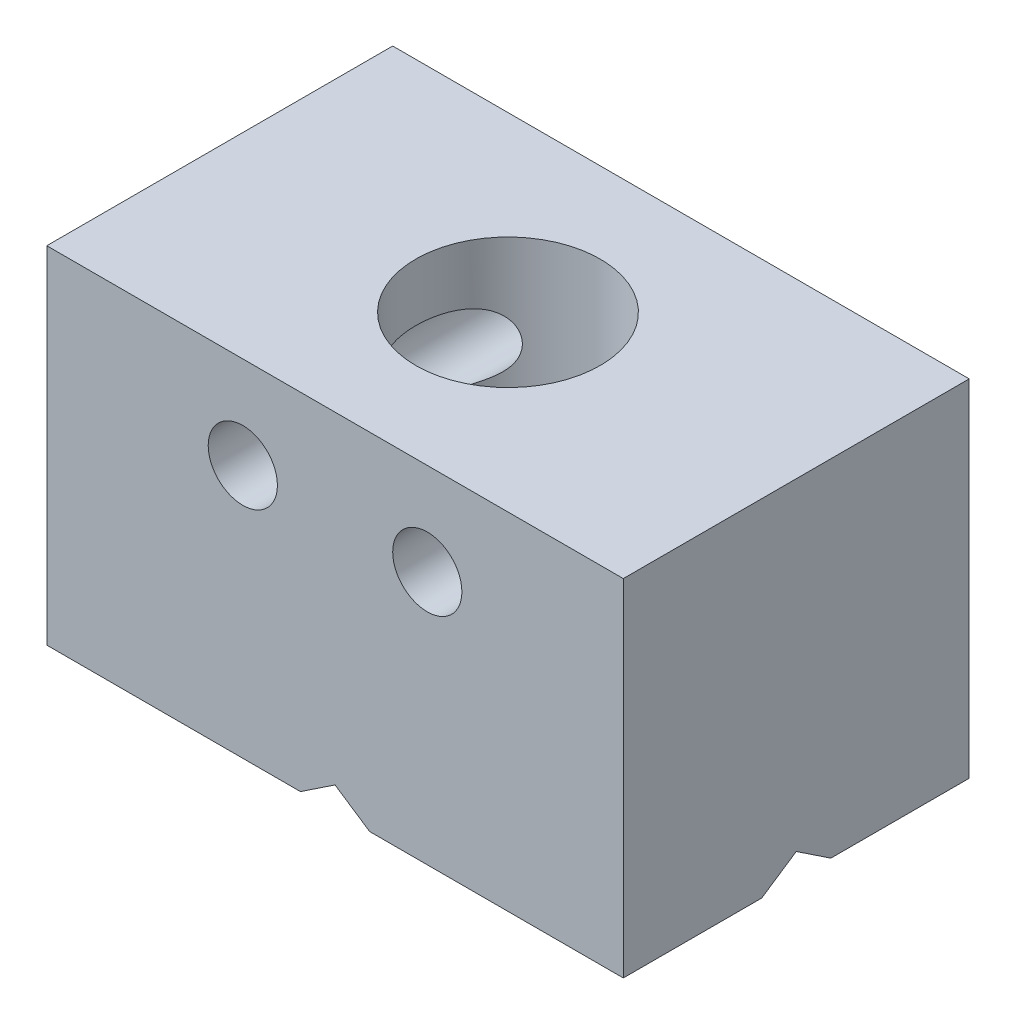
ISO-10303-21;
HEADER;
FILE_DESCRIPTION(('STEP AP214'),'2;1');
FILE_NAME('part.step','',(''),(''),'','','');
FILE_SCHEMA(('AUTOMOTIVE_DESIGN { 1 0 10303 214 1 1 1 1 }'));
ENDSEC;
DATA;
#1=APPLICATION_CONTEXT('core data for automotive mechanical design processes');
#2=APPLICATION_PROTOCOL_DEFINITION('international standard','automotive_design',2000,#1);
#3=PRODUCT_CONTEXT('',#1,'mechanical');
#4=PRODUCT('Part','Part','',(#3));
#5=PRODUCT_RELATED_PRODUCT_CATEGORY('part','',(#4));
#6=PRODUCT_DEFINITION_FORMATION('','',#4);
#7=PRODUCT_DEFINITION_CONTEXT('part definition',#1,'design');
#8=PRODUCT_DEFINITION('design','',#6,#7);
#9=PRODUCT_DEFINITION_SHAPE('','',#8);
#10=(LENGTH_UNIT() NAMED_UNIT(*) SI_UNIT(.MILLI.,.METRE.));
#11=(NAMED_UNIT(*) PLANE_ANGLE_UNIT() SI_UNIT($,.RADIAN.));
#12=(NAMED_UNIT(*) SI_UNIT($,.STERADIAN.) SOLID_ANGLE_UNIT());
#13=UNCERTAINTY_MEASURE_WITH_UNIT(LENGTH_MEASURE(1.E-05),#10,'distance_accuracy_value','');
#14=(GEOMETRIC_REPRESENTATION_CONTEXT(3) GLOBAL_UNCERTAINTY_ASSIGNED_CONTEXT((#13)) GLOBAL_UNIT_ASSIGNED_CONTEXT((#10,
#11,#12)) REPRESENTATION_CONTEXT('',''));
#15=CARTESIAN_POINT('',(0.,0.,0.));
#16=DIRECTION('',(0.,0.,1.));
#17=DIRECTION('',(1.,0.,0.));
#18=AXIS2_PLACEMENT_3D('',#15,#16,#17);
#19=CARTESIAN_POINT('',(12.5,-7.5,15.));
#20=DIRECTION('',(0.,1.,0.));
#21=DIRECTION('',(-1.,0.,0.));
#22=AXIS2_PLACEMENT_3D('',#19,#20,#21);
#23=PLANE('',#22);
#24=DIRECTION('',(0.,0.,-1.));
#25=VECTOR('',#24,1.);
#26=CARTESIAN_POINT('',(12.5,-7.5,15.));
#27=LINE('',#26,#25);
#28=CARTESIAN_POINT('',(12.5,-7.5,6.));
#29=VERTEX_POINT('',#28);
#30=CARTESIAN_POINT('',(12.5,-7.5,0.));
#31=VERTEX_POINT('',#30);
#32=EDGE_CURVE('E314',#29,#31,#27,.T.);
#33=ORIENTED_EDGE('',*,*,#32,.F.);
#34=DIRECTION('',(-1.,0.,0.));
#35=VECTOR('',#34,1.);
#36=CARTESIAN_POINT('',(36.5,-7.5,6.));
#37=LINE('',#36,#35);
#38=CARTESIAN_POINT('',(1.50000000000001,-7.50000000000001,6.));
#39=VERTEX_POINT('',#38);
#40=EDGE_CURVE('E385',#29,#39,#37,.T.);
#41=ORIENTED_EDGE('',*,*,#40,.T.);
#42=DIRECTION('',(0.,0.,-1.));
#43=VECTOR('',#42,1.);
#44=CARTESIAN_POINT('',(1.5,-7.5,15.));
#45=LINE('',#44,#43);
#46=CARTESIAN_POINT('',(1.5,-7.5,0.));
#47=VERTEX_POINT('',#46);
#48=EDGE_CURVE('E246',#39,#47,#45,.T.);
#49=ORIENTED_EDGE('',*,*,#48,.T.);
#50=DIRECTION('',(1.,0.,0.));
#51=VECTOR('',#50,1.);
#52=CARTESIAN_POINT('',(12.5,-7.5,0.));
#53=LINE('',#52,#51);
#54=EDGE_CURVE('E297',#47,#31,#53,.T.);
#55=ORIENTED_EDGE('',*,*,#54,.T.);
#56=EDGE_LOOP('',(#33,#41,#49,#55));
#57=FACE_BOUND('',#56,.T.);
#58=ADVANCED_FACE('F39',(#57),#23,.F.);
#59=DIRECTION('',(0.,0.,-1.));
#60=VECTOR('',#59,1.);
#61=CARTESIAN_POINT('',(-1.5,-7.5,15.));
#62=LINE('',#61,#60);
#63=CARTESIAN_POINT('',(-1.50000000000001,-7.5,6.));
#64=VERTEX_POINT('',#63);
#65=CARTESIAN_POINT('',(-1.5,-7.5,0.));
#66=VERTEX_POINT('',#65);
#67=EDGE_CURVE('E264',#64,#66,#62,.T.);
#68=ORIENTED_EDGE('',*,*,#67,.F.);
#69=CARTESIAN_POINT('',(-12.5,-7.5,6.));
#70=VERTEX_POINT('',#69);
#71=EDGE_CURVE('E375',#64,#70,#37,.T.);
#72=ORIENTED_EDGE('',*,*,#71,.T.);
#73=DIRECTION('',(0.,0.,-1.));
#74=VECTOR('',#73,1.);
#75=CARTESIAN_POINT('',(-12.5,-7.5,15.));
#76=LINE('',#75,#74);
#77=CARTESIAN_POINT('',(-12.5,-7.5,0.));
#78=VERTEX_POINT('',#77);
#79=EDGE_CURVE('E318',#70,#78,#76,.T.);
#80=ORIENTED_EDGE('',*,*,#79,.T.);
#81=EDGE_CURVE('E298',#78,#66,#53,.T.);
#82=ORIENTED_EDGE('',*,*,#81,.T.);
#83=EDGE_LOOP('',(#68,#72,#80,#82));
#84=FACE_BOUND('',#83,.T.);
#85=ADVANCED_FACE('F204',(#84),#23,.F.);
#86=CARTESIAN_POINT('',(1.5,-7.5,15.));
#87=DIRECTION('',(0.554700196225229,0.832050294337844,0.));
#88=DIRECTION('',(-0.832050294337844,0.554700196225229,0.));
#89=AXIS2_PLACEMENT_3D('',#86,#87,#88);
#90=PLANE('',#89);
#91=ORIENTED_EDGE('',*,*,#48,.F.);
#92=DIRECTION('',(-0.639602149066831,0.426401432711221,0.639602149066832));
#93=VECTOR('',#92,1.);
#94=CARTESIAN_POINT('',(-2.18181818181818,-5.04545454545455,9.68181818181819));
#95=LINE('',#94,#93);
#96=CARTESIAN_POINT('',(0.,-6.5,7.5));
#97=VERTEX_POINT('',#96);
#98=EDGE_CURVE('E342',#39,#97,#95,.T.);
#99=ORIENTED_EDGE('',*,*,#98,.T.);
#100=DIRECTION('',(0.,0.,-1.));
#101=VECTOR('',#100,1.);
#102=CARTESIAN_POINT('',(0.,-6.5,15.));
#103=LINE('',#102,#101);
#104=CARTESIAN_POINT('',(0.,-6.5,0.));
#105=VERTEX_POINT('',#104);
#106=EDGE_CURVE('E260',#97,#105,#103,.T.);
#107=ORIENTED_EDGE('',*,*,#106,.T.);
#108=DIRECTION('',(0.832050294337844,-0.554700196225229,0.));
#109=VECTOR('',#108,1.);
#110=CARTESIAN_POINT('',(1.5,-7.5,0.));
#111=LINE('',#110,#109);
#112=EDGE_CURVE('E256',#105,#47,#111,.T.);
#113=ORIENTED_EDGE('',*,*,#112,.T.);
#114=EDGE_LOOP('',(#91,#99,#107,#113));
#115=FACE_BOUND('',#114,.T.);
#116=ADVANCED_FACE('F190',(#115),#90,.F.);
#117=CARTESIAN_POINT('',(0.,-6.5,15.));
#118=DIRECTION('',(-0.554700196225229,0.832050294337844,0.));
#119=DIRECTION('',(-0.832050294337844,-0.554700196225229,0.));
#120=AXIS2_PLACEMENT_3D('',#117,#118,#119);
#121=PLANE('',#120);
#122=ORIENTED_EDGE('',*,*,#106,.F.);
#123=DIRECTION('',(-0.639602149066831,-0.42640143271122,-0.639602149066832));
#124=VECTOR('',#123,1.);
#125=CARTESIAN_POINT('',(3.06818181818182,-4.45454545454546,10.5681818181818));
#126=LINE('',#125,#124);
#127=EDGE_CURVE('E11',#97,#64,#126,.T.);
#128=ORIENTED_EDGE('',*,*,#127,.T.);
#129=ORIENTED_EDGE('',*,*,#67,.T.);
#130=DIRECTION('',(0.832050294337844,0.554700196225229,0.));
#131=VECTOR('',#130,1.);
#132=CARTESIAN_POINT('',(0.,-6.5,0.));
#133=LINE('',#132,#131);
#134=EDGE_CURVE('E336',#66,#105,#133,.T.);
#135=ORIENTED_EDGE('',*,*,#134,.T.);
#136=EDGE_LOOP('',(#122,#128,#129,#135));
#137=FACE_BOUND('',#136,.T.);
#138=ADVANCED_FACE('F193',(#137),#121,.F.);
#139=CARTESIAN_POINT('',(1.5,-7.5,15.));
#140=VERTEX_POINT('',#139);
#141=CARTESIAN_POINT('',(1.49999999999999,-7.5,9.));
#142=VERTEX_POINT('',#141);
#143=EDGE_CURVE('E238',#140,#142,#45,.T.);
#144=ORIENTED_EDGE('',*,*,#143,.T.);
#145=DIRECTION('',(-1.,0.,0.));
#146=VECTOR('',#145,1.);
#147=CARTESIAN_POINT('',(36.5,-7.5,9.));
#148=LINE('',#147,#146);
#149=CARTESIAN_POINT('',(12.5,-7.5,9.));
#150=VERTEX_POINT('',#149);
#151=EDGE_CURVE('E240',#150,#142,#148,.T.);
#152=ORIENTED_EDGE('',*,*,#151,.F.);
#153=CARTESIAN_POINT('',(12.5,-7.5,15.));
#154=VERTEX_POINT('',#153);
#155=EDGE_CURVE('E315',#154,#150,#27,.T.);
#156=ORIENTED_EDGE('',*,*,#155,.F.);
#157=DIRECTION('',(1.,0.,0.));
#158=VECTOR('',#157,1.);
#159=CARTESIAN_POINT('',(12.5,-7.5,15.));
#160=LINE('',#159,#158);
#161=EDGE_CURVE('E242',#140,#154,#160,.T.);
#162=ORIENTED_EDGE('',*,*,#161,.F.);
#163=EDGE_LOOP('',(#144,#152,#156,#162));
#164=FACE_BOUND('',#163,.T.);
#165=ADVANCED_FACE('F211',(#164),#23,.F.);
#166=CARTESIAN_POINT('',(0.,0.,0.));
#167=DIRECTION('',(0.,0.,1.));
#168=DIRECTION('',(1.,0.,0.));
#169=AXIS2_PLACEMENT_3D('',#166,#167,#168);
#170=PLANE('',#169);
#171=CARTESIAN_POINT('',(4.,3.5,0.));
#172=DIRECTION('',(0.,0.,-1.));
#173=DIRECTION('',(-1.,0.,0.));
#174=AXIS2_PLACEMENT_3D('',#171,#172,#173);
#175=CIRCLE('',#174,1.5);
#176=CARTESIAN_POINT('',(2.5,3.5,0.));
#177=VERTEX_POINT('',#176);
#178=EDGE_CURVE('E269',#177,#177,#175,.T.);
#179=ORIENTED_EDGE('',*,*,#178,.F.);
#180=EDGE_LOOP('',(#179));
#181=FACE_BOUND('',#180,.T.);
#182=ORIENTED_EDGE('',*,*,#54,.F.);
#183=ORIENTED_EDGE('',*,*,#112,.F.);
#184=ORIENTED_EDGE('',*,*,#134,.F.);
#185=ORIENTED_EDGE('',*,*,#81,.F.);
#186=DIRECTION('',(0.,-1.,0.));
#187=VECTOR('',#186,1.);
#188=CARTESIAN_POINT('',(-12.5,-7.5,0.));
#189=LINE('',#188,#187);
#190=CARTESIAN_POINT('',(-12.5,7.5,0.));
#191=VERTEX_POINT('',#190);
#192=EDGE_CURVE('E277',#191,#78,#189,.T.);
#193=ORIENTED_EDGE('',*,*,#192,.F.);
#194=DIRECTION('',(-1.,0.,0.));
#195=VECTOR('',#194,1.);
#196=CARTESIAN_POINT('',(12.5,7.5,0.));
#197=LINE('',#196,#195);
#198=CARTESIAN_POINT('',(12.5,7.5,0.));
#199=VERTEX_POINT('',#198);
#200=EDGE_CURVE('E282',#199,#191,#197,.T.);
#201=ORIENTED_EDGE('',*,*,#200,.F.);
#202=DIRECTION('',(0.,1.,0.));
#203=VECTOR('',#202,1.);
#204=CARTESIAN_POINT('',(12.5,-7.5,0.));
#205=LINE('',#204,#203);
#206=EDGE_CURVE('E302',#31,#199,#205,.T.);
#207=ORIENTED_EDGE('',*,*,#206,.F.);
#208=EDGE_LOOP('',(#182,#183,#184,#185,#193,#201,#207));
#209=FACE_BOUND('',#208,.T.);
#210=CARTESIAN_POINT('',(-4.,3.5,0.));
#211=DIRECTION('',(0.,0.,-1.));
#212=DIRECTION('',(-1.,0.,0.));
#213=AXIS2_PLACEMENT_3D('',#210,#211,#212);
#214=CIRCLE('',#213,1.5);
#215=CARTESIAN_POINT('',(-5.5,3.5,0.));
#216=VERTEX_POINT('',#215);
#217=EDGE_CURVE('E245',#216,#216,#214,.T.);
#218=ORIENTED_EDGE('',*,*,#217,.F.);
#219=EDGE_LOOP('',(#218));
#220=FACE_BOUND('',#219,.T.);
#221=ADVANCED_FACE('F223',(#181,#209,#220),#170,.F.);
#222=CARTESIAN_POINT('',(-12.5,-7.5,15.));
#223=DIRECTION('',(1.,0.,0.));
#224=DIRECTION('',(0.,0.,-1.));
#225=AXIS2_PLACEMENT_3D('',#222,#223,#224);
#226=PLANE('',#225);
#227=ORIENTED_EDGE('',*,*,#79,.F.);
#228=DIRECTION('',(0.,-0.554700196225229,-0.832050294337844));
#229=VECTOR('',#228,1.);
#230=CARTESIAN_POINT('',(-12.5,-7.5,6.));
#231=LINE('',#230,#229);
#232=CARTESIAN_POINT('',(-12.5,-6.5,7.5));
#233=VERTEX_POINT('',#232);
#234=EDGE_CURVE('E391',#233,#70,#231,.T.);
#235=ORIENTED_EDGE('',*,*,#234,.F.);
#236=DIRECTION('',(0.,0.554700196225228,-0.832050294337844));
#237=VECTOR('',#236,1.);
#238=CARTESIAN_POINT('',(-12.5,-6.5,7.5));
#239=LINE('',#238,#237);
#240=CARTESIAN_POINT('',(-12.5,-7.5,9.));
#241=VERTEX_POINT('',#240);
#242=EDGE_CURVE('E166',#241,#233,#239,.T.);
#243=ORIENTED_EDGE('',*,*,#242,.F.);
#244=CARTESIAN_POINT('',(-12.5,-7.5,15.));
#245=VERTEX_POINT('',#244);
#246=EDGE_CURVE('E319',#245,#241,#76,.T.);
#247=ORIENTED_EDGE('',*,*,#246,.F.);
#248=DIRECTION('',(0.,-1.,0.));
#249=VECTOR('',#248,1.);
#250=CARTESIAN_POINT('',(-12.5,-7.5,15.));
#251=LINE('',#250,#249);
#252=CARTESIAN_POINT('',(-12.5,7.5,15.));
#253=VERTEX_POINT('',#252);
#254=EDGE_CURVE('E278',#253,#245,#251,.T.);
#255=ORIENTED_EDGE('',*,*,#254,.F.);
#256=DIRECTION('',(0.,0.,-1.));
#257=VECTOR('',#256,1.);
#258=CARTESIAN_POINT('',(-12.5,7.5,15.));
#259=LINE('',#258,#257);
#260=EDGE_CURVE('E293',#253,#191,#259,.T.);
#261=ORIENTED_EDGE('',*,*,#260,.T.);
#262=ORIENTED_EDGE('',*,*,#192,.T.);
#263=EDGE_LOOP('',(#227,#235,#243,#247,#255,#261,#262));
#264=FACE_BOUND('',#263,.T.);
#265=ADVANCED_FACE('F41',(#264),#226,.F.);
#266=ORIENTED_EDGE('',*,*,#246,.T.);
#267=CARTESIAN_POINT('',(-1.50000000000001,-7.5,9.));
#268=VERTEX_POINT('',#267);
#269=EDGE_CURVE('E395',#268,#241,#148,.T.);
#270=ORIENTED_EDGE('',*,*,#269,.F.);
#271=CARTESIAN_POINT('',(-1.5,-7.5,15.));
#272=VERTEX_POINT('',#271);
#273=EDGE_CURVE('E261',#272,#268,#62,.T.);
#274=ORIENTED_EDGE('',*,*,#273,.F.);
#275=EDGE_CURVE('E283',#245,#272,#160,.T.);
#276=ORIENTED_EDGE('',*,*,#275,.F.);
#277=EDGE_LOOP('',(#266,#270,#274,#276));
#278=FACE_BOUND('',#277,.T.);
#279=ADVANCED_FACE('F206',(#278),#23,.F.);
#280=CARTESIAN_POINT('',(12.5,-7.5,15.));
#281=DIRECTION('',(-1.,0.,0.));
#282=DIRECTION('',(0.,0.,1.));
#283=AXIS2_PLACEMENT_3D('',#280,#281,#282);
#284=PLANE('',#283);
#285=DIRECTION('',(0.,0.554700196225228,-0.832050294337845));
#286=VECTOR('',#285,1.);
#287=CARTESIAN_POINT('',(12.5,-10.2692307692308,13.1538461538462));
#288=LINE('',#287,#286);
#289=CARTESIAN_POINT('',(12.5,-6.5,7.5));
#290=VERTEX_POINT('',#289);
#291=EDGE_CURVE('E346',#150,#290,#288,.T.);
#292=ORIENTED_EDGE('',*,*,#291,.T.);
#293=DIRECTION('',(0.,-0.554700196225229,-0.832050294337844));
#294=VECTOR('',#293,1.);
#295=CARTESIAN_POINT('',(12.5,-3.34615384615385,12.2307692307692));
#296=LINE('',#295,#294);
#297=EDGE_CURVE('E345',#290,#29,#296,.T.);
#298=ORIENTED_EDGE('',*,*,#297,.T.);
#299=ORIENTED_EDGE('',*,*,#32,.T.);
#300=ORIENTED_EDGE('',*,*,#206,.T.);
#301=DIRECTION('',(0.,0.,-1.));
#302=VECTOR('',#301,1.);
#303=CARTESIAN_POINT('',(12.5,7.5,15.));
#304=LINE('',#303,#302);
#305=CARTESIAN_POINT('',(12.5,7.5,15.));
#306=VERTEX_POINT('',#305);
#307=EDGE_CURVE('E310',#306,#199,#304,.T.);
#308=ORIENTED_EDGE('',*,*,#307,.F.);
#309=DIRECTION('',(0.,1.,0.));
#310=VECTOR('',#309,1.);
#311=CARTESIAN_POINT('',(12.5,-7.5,15.));
#312=LINE('',#311,#310);
#313=EDGE_CURVE('E287',#154,#306,#312,.T.);
#314=ORIENTED_EDGE('',*,*,#313,.F.);
#315=ORIENTED_EDGE('',*,*,#155,.T.);
#316=EDGE_LOOP('',(#292,#298,#299,#300,#308,#314,#315));
#317=FACE_BOUND('',#316,.T.);
#318=ADVANCED_FACE('F215',(#317),#284,.F.);
#319=CARTESIAN_POINT('',(12.5,7.5,15.));
#320=DIRECTION('',(0.,-1.,0.));
#321=DIRECTION('',(1.,0.,0.));
#322=AXIS2_PLACEMENT_3D('',#319,#320,#321);
#323=PLANE('',#322);
#324=CARTESIAN_POINT('',(0.,7.5,7.5));
#325=DIRECTION('',(0.,1.,0.));
#326=DIRECTION('',(0.,0.,1.));
#327=AXIS2_PLACEMENT_3D('',#324,#325,#326);
#328=CIRCLE('',#327,4.);
#329=CARTESIAN_POINT('',(0.,7.5,11.5));
#330=VERTEX_POINT('',#329);
#331=EDGE_CURVE('E150',#330,#330,#328,.T.);
#332=ORIENTED_EDGE('',*,*,#331,.F.);
#333=EDGE_LOOP('',(#332));
#334=FACE_BOUND('',#333,.T.);
#335=ORIENTED_EDGE('',*,*,#200,.T.);
#336=ORIENTED_EDGE('',*,*,#260,.F.);
#337=DIRECTION('',(-1.,0.,0.));
#338=VECTOR('',#337,1.);
#339=CARTESIAN_POINT('',(12.5,7.5,15.));
#340=LINE('',#339,#338);
#341=EDGE_CURVE('E290',#306,#253,#340,.T.);
#342=ORIENTED_EDGE('',*,*,#341,.F.);
#343=ORIENTED_EDGE('',*,*,#307,.T.);
#344=EDGE_LOOP('',(#335,#336,#342,#343));
#345=FACE_BOUND('',#344,.T.);
#346=ADVANCED_FACE('F221',(#334,#345),#323,.F.);
#347=CARTESIAN_POINT('',(0.,0.,15.));
#348=DIRECTION('',(0.,0.,1.));
#349=DIRECTION('',(1.,0.,0.));
#350=AXIS2_PLACEMENT_3D('',#347,#348,#349);
#351=PLANE('',#350);
#352=DIRECTION('',(0.832050294337844,-0.554700196225229,0.));
#353=VECTOR('',#352,1.);
#354=CARTESIAN_POINT('',(1.5,-7.5,15.));
#355=LINE('',#354,#353);
#356=CARTESIAN_POINT('',(0.,-6.5,15.));
#357=VERTEX_POINT('',#356);
#358=EDGE_CURVE('E69',#357,#140,#355,.T.);
#359=ORIENTED_EDGE('',*,*,#358,.T.);
#360=ORIENTED_EDGE('',*,*,#161,.T.);
#361=ORIENTED_EDGE('',*,*,#313,.T.);
#362=ORIENTED_EDGE('',*,*,#341,.T.);
#363=ORIENTED_EDGE('',*,*,#254,.T.);
#364=ORIENTED_EDGE('',*,*,#275,.T.);
#365=DIRECTION('',(0.832050294337844,0.554700196225229,0.));
#366=VECTOR('',#365,1.);
#367=CARTESIAN_POINT('',(0.,-6.5,15.));
#368=LINE('',#367,#366);
#369=EDGE_CURVE('E356',#272,#357,#368,.T.);
#370=ORIENTED_EDGE('',*,*,#369,.T.);
#371=EDGE_LOOP('',(#359,#360,#361,#362,#363,#364,#370));
#372=FACE_BOUND('',#371,.T.);
#373=CARTESIAN_POINT('',(-4.,3.5,15.));
#374=DIRECTION('',(0.,0.,1.));
#375=DIRECTION('',(1.,0.,0.));
#376=AXIS2_PLACEMENT_3D('',#373,#374,#375);
#377=CIRCLE('',#376,1.5);
#378=CARTESIAN_POINT('',(-2.5,3.5,15.));
#379=VERTEX_POINT('',#378);
#380=EDGE_CURVE('E251',#379,#379,#377,.T.);
#381=ORIENTED_EDGE('',*,*,#380,.F.);
#382=EDGE_LOOP('',(#381));
#383=FACE_BOUND('',#382,.T.);
#384=CARTESIAN_POINT('',(4.,3.5,15.));
#385=DIRECTION('',(0.,0.,1.));
#386=DIRECTION('',(1.,0.,0.));
#387=AXIS2_PLACEMENT_3D('',#384,#385,#386);
#388=CIRCLE('',#387,1.5);
#389=CARTESIAN_POINT('',(5.5,3.5,15.));
#390=VERTEX_POINT('',#389);
#391=EDGE_CURVE('E273',#390,#390,#388,.T.);
#392=ORIENTED_EDGE('',*,*,#391,.F.);
#393=EDGE_LOOP('',(#392));
#394=FACE_BOUND('',#393,.T.);
#395=ADVANCED_FACE('F200',(#372,#383,#394),#351,.T.);
#396=CARTESIAN_POINT('',(4.,3.5,0.));
#397=DIRECTION('',(0.,0.,-1.));
#398=DIRECTION('',(-1.,0.,0.));
#399=AXIS2_PLACEMENT_3D('',#396,#397,#398);
#400=CYLINDRICAL_SURFACE('',#399,1.5);
#401=CARTESIAN_POINT('',(2.5,3.5,10.6224989991992));
#402=CARTESIAN_POINT('',(2.50000237563999,3.56844507317665,10.6224984583015));
#403=CARTESIAN_POINT('',(2.5047136716075,3.63691446866875,10.6187428307556));
#404=CARTESIAN_POINT('',(2.52325594483903,3.77178518304479,10.6037583970504));
#405=CARTESIAN_POINT('',(2.53709204758336,3.83818531764219,10.5925253907517));
#406=CARTESIAN_POINT('',(2.57293547359494,3.96683585866649,10.5627665406718));
#407=CARTESIAN_POINT('',(2.59492392949486,4.02909545838286,10.544257530167));
#408=CARTESIAN_POINT('',(2.64568692155641,4.14809251520525,10.5002439315446));
#409=CARTESIAN_POINT('',(2.67446128429536,4.20483011338085,10.4747395222009));
#410=CARTESIAN_POINT('',(2.73810694361181,4.31345865663773,10.4162796101607));
#411=CARTESIAN_POINT('',(2.77314279157787,4.36513856482558,10.3831132724741));
#412=CARTESIAN_POINT('',(2.84670451040628,4.46102493857734,10.3105073956264));
#413=CARTESIAN_POINT('',(2.88523184758638,4.50522824165037,10.2710652155004));
#414=CARTESIAN_POINT('',(2.98141478003728,4.60413824909643,10.167967855078));
#415=CARTESIAN_POINT('',(3.03999055907052,4.65483708709788,10.1013215740566));
#416=CARTESIAN_POINT('',(3.15634540786731,4.74241053870565,9.95885833615759));
#417=CARTESIAN_POINT('',(3.21412255353142,4.77925599629143,9.88302247712024));
#418=CARTESIAN_POINT('',(3.31084375081771,4.83313297491591,9.74574395953113));
#419=CARTESIAN_POINT('',(3.35067029539931,4.85282826677813,9.685923115564));
#420=CARTESIAN_POINT('',(3.42763315063207,4.88714573550983,9.5631476523231));
#421=CARTESIAN_POINT('',(3.46476819384456,4.9017655344335,9.50019157989876));
#422=CARTESIAN_POINT('',(3.53588883198726,4.92689379907789,9.37160402893009));
#423=CARTESIAN_POINT('',(3.56986876735441,4.93739498165646,9.30596803555821));
#424=CARTESIAN_POINT('',(3.63429262498123,4.95511965276579,9.17254581884858));
#425=CARTESIAN_POINT('',(3.66473552255354,4.96234219321991,9.10475897961111));
#426=CARTESIAN_POINT('',(3.73424945418183,4.97686603409856,8.93761793820791));
#427=CARTESIAN_POINT('',(3.77133858388427,4.9828437471954,8.83731993597372));
#428=CARTESIAN_POINT('',(3.83739983959433,4.9915325535692,8.63393472747066));
#429=CARTESIAN_POINT('',(3.86636878431439,4.99424236793342,8.53084644533476));
#430=CARTESIAN_POINT('',(3.91595520583396,4.99785006983944,8.32264574868139));
#431=CARTESIAN_POINT('',(3.93657214290123,4.99874784029636,8.21753320380953));
#432=CARTESIAN_POINT('',(3.96930846625382,4.99977538627892,8.00600747540295));
#433=CARTESIAN_POINT('',(3.98142902695387,4.99990526796472,7.89959447369405));
#434=CARTESIAN_POINT('',(3.99721714653658,5.00001873923238,7.68453548116398));
#435=CARTESIAN_POINT('',(4.0007550770072,5.00000010339922,7.57587995000957));
#436=CARTESIAN_POINT('',(3.99897687795857,4.99999988466274,7.35863227418447));
#437=CARTESIAN_POINT('',(3.99365999729639,5.00001830490286,7.25004013567302));
#438=CARTESIAN_POINT('',(3.9742028497557,4.99980955757465,7.03360684173076));
#439=CARTESIAN_POINT('',(3.96005907813689,4.99958229243003,6.92576600181108));
#440=CARTESIAN_POINT('',(3.92304029316416,4.99813921620254,6.71160994759171));
#441=CARTESIAN_POINT('',(3.90016668323858,4.9969235639795,6.60529449091701));
#442=CARTESIAN_POINT('',(3.85025790288879,4.99268058370033,6.41197311843918));
#443=CARTESIAN_POINT('',(3.82449737909757,4.9899786847842,6.32462943376112));
#444=CARTESIAN_POINT('',(3.76711879145319,4.98209511109492,6.15200695391245));
#445=CARTESIAN_POINT('',(3.73550176357429,4.97691387464283,6.06672779655355));
#446=CARTESIAN_POINT('',(3.66670387500693,4.96292317926729,5.89891037191243));
#447=CARTESIAN_POINT('',(3.62953309661458,4.95412024542263,5.81636746235808));
#448=CARTESIAN_POINT('',(3.5500016579635,4.93150564603682,5.65457023883274));
#449=CARTESIAN_POINT('',(3.50764387637116,4.9176967504208,5.57531413316441));
#450=CARTESIAN_POINT('',(3.4076641107847,4.87936918867664,5.40237809649182));
#451=CARTESIAN_POINT('',(3.34881312115841,4.85307997905936,5.30977626891723));
#452=CARTESIAN_POINT('',(3.22625565514691,4.78691453896872,5.13297996612255));
#453=CARTESIAN_POINT('',(3.16255615588575,4.74705755623722,5.04877379811164));
#454=CARTESIAN_POINT('',(3.04789849020029,4.6608103465126,4.908339044801));
#455=CARTESIAN_POINT('',(2.99713759545654,4.61765445141011,4.84998331201076));
#456=CARTESIAN_POINT('',(2.89777469371295,4.51977526049942,4.74168892905724));
#457=CARTESIAN_POINT('',(2.8491701755548,4.46506587098744,4.69174028847616));
#458=CARTESIAN_POINT('',(2.76519273286627,4.3539704191013,4.60922176672559));
#459=CARTESIAN_POINT('',(2.72896106140803,4.29935890714051,4.57514386857898));
#460=CARTESIAN_POINT('',(2.66264346340817,4.18262390331085,4.51464457345066));
#461=CARTESIAN_POINT('',(2.63255606089229,4.12050222125433,4.48822133702875));
#462=CARTESIAN_POINT('',(2.580481743993,3.98983187660056,4.44348096350365));
#463=CARTESIAN_POINT('',(2.55853276109643,3.92125494160811,4.42520170605563));
#464=CARTESIAN_POINT('',(2.52457600134729,3.77999074352951,4.39725790112044));
#465=CARTESIAN_POINT('',(2.51256593266413,3.70730443216345,4.38759136757164));
#466=CARTESIAN_POINT('',(2.49995949164929,3.56661905930583,4.37745955303601));
#467=CARTESIAN_POINT('',(2.49847718132942,3.49874883019748,4.37627995264991));
#468=CARTESIAN_POINT('',(2.50467726966921,3.36371296656086,4.38124893815317));
#469=CARTESIAN_POINT('',(2.51235709343259,3.29654713942024,4.38739546513114));
#470=CARTESIAN_POINT('',(2.53608695804431,3.16649848612624,4.40670306421038));
#471=CARTESIAN_POINT('',(2.55192843404271,3.10355117031841,4.4196895233468));
#472=CARTESIAN_POINT('',(2.59089637791697,2.98181778654184,4.4523946016844));
#473=CARTESIAN_POINT('',(2.61402298183211,2.92303179630498,4.47211334660193));
#474=CARTESIAN_POINT('',(2.66720635243565,2.80878386720134,4.51884197598395));
#475=CARTESIAN_POINT('',(2.69749032182361,2.75352901504156,4.5460973734986));
#476=CARTESIAN_POINT('',(2.76272887503185,2.649751385927,4.60702257553303));
#477=CARTESIAN_POINT('',(2.79768497312702,2.60123080204019,4.64069446120147));
#478=CARTESIAN_POINT('',(2.87449570764897,2.50633748552443,4.7178166642497));
#479=CARTESIAN_POINT('',(2.91668647917853,2.46078376990674,4.76193437095376));
#480=CARTESIAN_POINT('',(3.00247716932196,2.3781701668522,4.85629067039247));
#481=CARTESIAN_POINT('',(3.04607781384109,2.34111473703709,4.90653245433796));
#482=CARTESIAN_POINT('',(3.12439434614296,2.28129365189303,5.00176351975041));
#483=CARTESIAN_POINT('',(3.15917600317504,2.25715074197405,5.04585100558664));
#484=CARTESIAN_POINT('',(3.22783881457725,2.21336733452573,5.13688403107681));
#485=CARTESIAN_POINT('',(3.26171951636781,2.19372906341603,5.18383096957216));
#486=CARTESIAN_POINT('',(3.36131492719747,2.1406740116261,5.32854214561394));
#487=CARTESIAN_POINT('',(3.4248571664884,2.11320620274763,5.43002586353859));
#488=CARTESIAN_POINT('',(3.52881497633681,2.07513232617044,5.61431116745028));
#489=CARTESIAN_POINT('',(3.57108810228181,2.06204631243266,5.69562026760816));
#490=CARTESIAN_POINT('',(3.65018259075764,2.04078598978266,5.86152487578542));
#491=CARTESIAN_POINT('',(3.68700107966248,2.03261426294189,5.94612208664085));
#492=CARTESIAN_POINT('',(3.75479257296722,2.0197755728349,6.11794411563752));
#493=CARTESIAN_POINT('',(3.78576059964336,2.01511158407578,6.20517109874891));
#494=CARTESIAN_POINT('',(3.84158922458768,2.00812308305104,6.38162881441569));
#495=CARTESIAN_POINT('',(3.86645066534816,2.00579824792799,6.47085926870708));
#496=CARTESIAN_POINT('',(3.91093780371362,2.0024722829463,6.65504168823637));
#497=CARTESIAN_POINT('',(3.9302659562343,2.00153779883961,6.75006665360376));
#498=CARTESIAN_POINT('',(3.96197145568193,2.0003982884312,6.9412742486933));
#499=CARTESIAN_POINT('',(3.97434855808809,2.00019328778956,7.03745691901909));
#500=CARTESIAN_POINT('',(3.99208436342167,1.99999450956277,7.23045940593527));
#501=CARTESIAN_POINT('',(3.99744370426902,2.00000071277766,7.3272791638097));
#502=CARTESIAN_POINT('',(4.00111845761146,1.99999963178988,7.5210523073506));
#503=CARTESIAN_POINT('',(3.99943363062662,1.99999234712868,7.61800569744814));
#504=CARTESIAN_POINT('',(3.98820387830326,2.00003281208052,7.82683175038031));
#505=CARTESIAN_POINT('',(3.97745942474938,2.00008943655868,7.93864197287056));
#506=CARTESIAN_POINT('',(3.94660624742879,2.00087172125266,8.16098670349158));
#507=CARTESIAN_POINT('',(3.92649499822109,2.00159756195182,8.27152085933242));
#508=CARTESIAN_POINT('',(3.87705217131453,2.00484163439915,8.49048129031715));
#509=CARTESIAN_POINT('',(3.84772182513464,2.00735962680224,8.59890784494875));
#510=CARTESIAN_POINT('',(3.78012274194193,2.01581314626652,8.81272795806287));
#511=CARTESIAN_POINT('',(3.74185863293169,2.02174690616494,8.91812305530233));
#512=CARTESIAN_POINT('',(3.6454170968873,2.04146709200524,9.15254593329164));
#513=CARTESIAN_POINT('',(3.58464996952906,2.05692057732798,9.28041577750395));
#514=CARTESIAN_POINT('',(3.4846337037185,2.09087988565139,9.46526176775417));
#515=CARTESIAN_POINT('',(3.44984163064994,2.10398472653708,9.52568204344411));
#516=CARTESIAN_POINT('',(3.37770277497338,2.13461202905426,9.64380682121691));
#517=CARTESIAN_POINT('',(3.34035685578596,2.15213300297942,9.70151223013056));
#518=CARTESIAN_POINT('',(3.24697782951465,2.20122118372719,9.83807744471173));
#519=CARTESIAN_POINT('',(3.18987059889643,2.23558412348528,9.91524533060743));
#520=CARTESIAN_POINT('',(3.07416675808938,2.31769689732622,10.0608812829434));
#521=CARTESIAN_POINT('',(3.01557243079513,2.36542722187517,10.1293618183981));
#522=CARTESIAN_POINT('',(2.91291491153056,2.46452320694735,10.2421688078778));
#523=CARTESIAN_POINT('',(2.86837671809878,2.51303814899894,10.288551020765));
#524=CARTESIAN_POINT('',(2.78346269313089,2.61984057571062,10.3733136254166));
#525=CARTESIAN_POINT('',(2.74308610027774,2.67812626778185,10.4116954820723));
#526=CARTESIAN_POINT('',(2.66908238580457,2.80426761557776,10.4796908268526));
#527=CARTESIAN_POINT('',(2.63551043442811,2.87219445054717,10.5092335004171));
#528=CARTESIAN_POINT('',(2.57834311486124,3.01542611137453,10.5583633148209));
#529=CARTESIAN_POINT('',(2.55473421618741,3.09072075884043,10.5779639649427));
#530=CARTESIAN_POINT('',(2.52493344277133,3.22208295292628,10.60241077309));
#531=CARTESIAN_POINT('',(2.51562166238074,3.27697517767308,10.6099373523411));
#532=CARTESIAN_POINT('',(2.50315449914521,3.38790629673264,10.6199812548714));
#533=CARTESIAN_POINT('',(2.49999805440314,3.44394499157444,10.6224994421825));
#534=CARTESIAN_POINT('',(2.5,3.5,10.6224989991992));
#535=B_SPLINE_CURVE_WITH_KNOTS('',3,(#401,#402,#403,#404,#405,#406,#407,#408,#409,#410,#411,
#412,#413,#414,#415,#416,#417,#418,#419,#420,#421,#422,#423,#424,#425,#426,#427,#428,#429,#430,
#431,#432,#433,#434,#435,#436,#437,#438,#439,#440,#441,#442,#443,#444,#445,#446,#447,#448,#449,
#450,#451,#452,#453,#454,#455,#456,#457,#458,#459,#460,#461,#462,#463,#464,#465,#466,#467,#468,
#469,#470,#471,#472,#473,#474,#475,#476,#477,#478,#479,#480,#481,#482,#483,#484,#485,#486,#487,
#488,#489,#490,#491,#492,#493,#494,#495,#496,#497,#498,#499,#500,#501,#502,#503,#504,#505,#506,
#507,#508,#509,#510,#511,#512,#513,#514,#515,#516,#517,#518,#519,#520,#521,#522,#523,#524,#525,
#526,#527,#528,#529,#530,#531,#532,#533,#534),.UNSPECIFIED.,.T.,.F.,(4,2,2,2,2,2,2,2,2,2,2,2,2,
2,2,2,2,2,2,2,2,2,2,2,2,2,2,2,2,2,2,2,2,2,2,2,2,2,2,2,2,2,2,2,2,2,2,2,2,2,2,2,2,2,2,2,2,2,2,2,2,
2,2,2,2,2,4),(0.,0.20511725306374,0.410349820449429,0.615110343780093,0.819865634756342,
1.03112095172278,1.24246540423323,1.54733227640782,1.85283723114669,2.07609167139003,
2.29945056902766,2.52320268077713,2.74701945320753,3.06787721875676,3.38886051330489,
3.70986454746678,4.03082420197497,4.35660211946841,4.68240767371595,5.00834267229062,
5.33422529488179,5.60730989741636,5.88034623926416,6.15289280091717,6.42528878528101,
6.76276661743867,7.09976767263842,7.36449453354524,7.62890455533673,7.84957400377987,
8.07019038056348,8.29182245097997,8.51340340064028,8.71608974088741,8.9187191322426,
9.11640994397853,9.31410444752505,9.51920653647029,9.72437526260036,9.95204292451516,
10.1798297336307,10.3629514425138,10.5461634652915,10.9132267988266,11.1906197709143,
11.4681583641511,11.7459320412421,12.0236673738635,12.3143294073095,12.6050016648879,
12.8956474982996,13.186303212852,13.522870341105,13.8595282659261,14.1961412379115,
14.5325802179655,14.958375862362,15.1710105556163,15.3835737120404,15.6884169525327,
15.9928175761044,16.233520753634,16.4741798188334,16.7167182375865,16.9589262048101,
17.1269417083647,17.2949282239031),.UNSPECIFIED.);
#536=CARTESIAN_POINT('',(2.5,3.5,10.6224989991992));
#537=VERTEX_POINT('',#536);
#538=EDGE_CURVE('E155',#537,#537,#535,.T.);
#539=ORIENTED_EDGE('',*,*,#538,.T.);
#540=EDGE_LOOP('',(#539));
#541=FACE_BOUND('',#540,.T.);
#542=ORIENTED_EDGE('',*,*,#178,.T.);
#543=EDGE_LOOP('',(#542));
#544=FACE_BOUND('',#543,.T.);
#545=ORIENTED_EDGE('',*,*,#391,.T.);
#546=EDGE_LOOP('',(#545));
#547=FACE_BOUND('',#546,.T.);
#548=ADVANCED_FACE('F168',(#541,#544,#547),#400,.F.);
#549=CARTESIAN_POINT('',(-4.,3.5,0.));
#550=DIRECTION('',(0.,0.,-1.));
#551=DIRECTION('',(-1.,0.,0.));
#552=AXIS2_PLACEMENT_3D('',#549,#550,#551);
#553=CYLINDRICAL_SURFACE('',#552,1.5);
#554=CARTESIAN_POINT('',(-2.5,3.5,10.6224989991992));
#555=CARTESIAN_POINT('',(-2.50000237563999,3.43155492682334,10.6224984583015));
#556=CARTESIAN_POINT('',(-2.5047136716075,3.36308553133125,10.6187428307556));
#557=CARTESIAN_POINT('',(-2.52325594483903,3.22821481695521,10.6037583970504));
#558=CARTESIAN_POINT('',(-2.53709204758336,3.1618146823578,10.5925253907517));
#559=CARTESIAN_POINT('',(-2.57293547359494,3.0331641413335,10.5627665406718));
#560=CARTESIAN_POINT('',(-2.59492392949486,2.97090454161713,10.544257530167));
#561=CARTESIAN_POINT('',(-2.64568692155641,2.85190748479475,10.5002439315446));
#562=CARTESIAN_POINT('',(-2.67446128429536,2.79516988661915,10.4747395222009));
#563=CARTESIAN_POINT('',(-2.73810694361181,2.68654134336226,10.4162796101607));
#564=CARTESIAN_POINT('',(-2.77314279157787,2.63486143517441,10.3831132724741));
#565=CARTESIAN_POINT('',(-2.84670451040628,2.53897506142265,10.3105073956264));
#566=CARTESIAN_POINT('',(-2.88523184758638,2.49477175834962,10.2710652155004));
#567=CARTESIAN_POINT('',(-2.98141478003728,2.39586175090357,10.167967855078));
#568=CARTESIAN_POINT('',(-3.03999055907052,2.34516291290212,10.1013215740566));
#569=CARTESIAN_POINT('',(-3.15634540786731,2.25758946129434,9.95885833615759));
#570=CARTESIAN_POINT('',(-3.21412255353142,2.22074400370856,9.88302247712024));
#571=CARTESIAN_POINT('',(-3.31084375081771,2.16686702508408,9.74574395953113));
#572=CARTESIAN_POINT('',(-3.35067029539931,2.14717173322186,9.685923115564));
#573=CARTESIAN_POINT('',(-3.42763315063208,2.11285426449016,9.5631476523231));
#574=CARTESIAN_POINT('',(-3.46476819384456,2.0982344655665,9.50019157989876));
#575=CARTESIAN_POINT('',(-3.53588883198726,2.07310620092211,9.3716040289301));
#576=CARTESIAN_POINT('',(-3.56986876735441,2.06260501834354,9.30596803555821));
#577=CARTESIAN_POINT('',(-3.63429262498123,2.0448803472342,9.17254581884859));
#578=CARTESIAN_POINT('',(-3.66473552255354,2.03765780678008,9.10475897961112));
#579=CARTESIAN_POINT('',(-3.73424945418183,2.02313396590143,8.93761793820792));
#580=CARTESIAN_POINT('',(-3.77133858388427,2.0171562528046,8.83731993597373));
#581=CARTESIAN_POINT('',(-3.83739983959433,2.0084674464308,8.63393472747066));
#582=CARTESIAN_POINT('',(-3.86636878431439,2.00575763206658,8.53084644533476));
#583=CARTESIAN_POINT('',(-3.91595520583397,2.00214993016055,8.32264574868139));
#584=CARTESIAN_POINT('',(-3.93657214290123,2.00125215970363,8.21753320380953));
#585=CARTESIAN_POINT('',(-3.96930846625382,2.00022461372108,8.00600747540295));
#586=CARTESIAN_POINT('',(-3.98142902695387,2.00009473203527,7.89959447369405));
#587=CARTESIAN_POINT('',(-3.99721714653658,1.99998126076761,7.68453548116399));
#588=CARTESIAN_POINT('',(-4.00075507700721,1.99999989660077,7.57587995000957));
#589=CARTESIAN_POINT('',(-3.99897687795857,2.00000011533726,7.35863227418447));
#590=CARTESIAN_POINT('',(-3.9936599972964,1.99998169509713,7.25004013567302));
#591=CARTESIAN_POINT('',(-3.9742028497557,2.00019044242534,7.03360684173077));
#592=CARTESIAN_POINT('',(-3.96005907813689,2.00041770756996,6.92576600181108));
#593=CARTESIAN_POINT('',(-3.92304029316416,2.00186078379745,6.71160994759171));
#594=CARTESIAN_POINT('',(-3.90016668323858,2.00307643602049,6.60529449091702));
#595=CARTESIAN_POINT('',(-3.8502579028888,2.00731941629966,6.41197311843918));
#596=CARTESIAN_POINT('',(-3.82449737909757,2.0100213152158,6.32462943376112));
#597=CARTESIAN_POINT('',(-3.7671187914532,2.01790488890507,6.15200695391245));
#598=CARTESIAN_POINT('',(-3.7355017635743,2.02308612535716,6.06672779655355));
#599=CARTESIAN_POINT('',(-3.66670387500693,2.03707682073271,5.89891037191243));
#600=CARTESIAN_POINT('',(-3.62953309661458,2.04587975457736,5.81636746235808));
#601=CARTESIAN_POINT('',(-3.5500016579635,2.06849435396317,5.65457023883274));
#602=CARTESIAN_POINT('',(-3.50764387637116,2.0823032495792,5.57531413316441));
#603=CARTESIAN_POINT('',(-3.40766411078471,2.12063081132336,5.40237809649182));
#604=CARTESIAN_POINT('',(-3.34881312115841,2.14692002094063,5.30977626891723));
#605=CARTESIAN_POINT('',(-3.22625565514691,2.21308546103127,5.13297996612255));
#606=CARTESIAN_POINT('',(-3.16255615588575,2.25294244376278,5.04877379811163));
#607=CARTESIAN_POINT('',(-3.04789849020029,2.33918965348739,4.908339044801));
#608=CARTESIAN_POINT('',(-2.99713759545654,2.38234554858988,4.84998331201076));
#609=CARTESIAN_POINT('',(-2.89777469371295,2.48022473950058,4.74168892905724));
#610=CARTESIAN_POINT('',(-2.8491701755548,2.53493412901256,4.69174028847616));
#611=CARTESIAN_POINT('',(-2.76519273286628,2.64602958089869,4.60922176672559));
#612=CARTESIAN_POINT('',(-2.72896106140803,2.70064109285948,4.57514386857898));
#613=CARTESIAN_POINT('',(-2.66264346340817,2.81737609668915,4.51464457345066));
#614=CARTESIAN_POINT('',(-2.6325560608923,2.87949777874567,4.48822133702875));
#615=CARTESIAN_POINT('',(-2.580481743993,3.01016812339943,4.44348096350365));
#616=CARTESIAN_POINT('',(-2.55853276109643,3.07874505839188,4.42520170605563));
#617=CARTESIAN_POINT('',(-2.52457600134729,3.22000925647048,4.39725790112044));
#618=CARTESIAN_POINT('',(-2.51256593266413,3.29269556783654,4.38759136757164));
#619=CARTESIAN_POINT('',(-2.49995949164929,3.43338094069417,4.37745955303601));
#620=CARTESIAN_POINT('',(-2.49847718132942,3.50125116980251,4.37627995264991));
#621=CARTESIAN_POINT('',(-2.50467726966921,3.63628703343913,4.38124893815316));
#622=CARTESIAN_POINT('',(-2.51235709343259,3.70345286057976,4.38739546513114));
#623=CARTESIAN_POINT('',(-2.53608695804431,3.83350151387375,4.40670306421038));
#624=CARTESIAN_POINT('',(-2.55192843404272,3.89644882968158,4.4196895233468));
#625=CARTESIAN_POINT('',(-2.59089637791697,4.01818221345816,4.4523946016844));
#626=CARTESIAN_POINT('',(-2.61402298183211,4.07696820369502,4.47211334660193));
#627=CARTESIAN_POINT('',(-2.66720635243565,4.19121613279866,4.51884197598395));
#628=CARTESIAN_POINT('',(-2.69749032182361,4.24647098495843,4.5460973734986));
#629=CARTESIAN_POINT('',(-2.76272887503185,4.35024861407299,4.60702257553303));
#630=CARTESIAN_POINT('',(-2.79768497312702,4.3987691979598,4.64069446120147));
#631=CARTESIAN_POINT('',(-2.87449570764897,4.49366251447557,4.7178166642497));
#632=CARTESIAN_POINT('',(-2.91668647917854,4.53921623009326,4.76193437095375));
#633=CARTESIAN_POINT('',(-3.00247716932196,4.6218298331478,4.85629067039247));
#634=CARTESIAN_POINT('',(-3.04607781384109,4.6588852629629,4.90653245433796));
#635=CARTESIAN_POINT('',(-3.12439434614296,4.71870634810697,5.00176351975041));
#636=CARTESIAN_POINT('',(-3.15917600317504,4.74284925802594,5.04585100558663));
#637=CARTESIAN_POINT('',(-3.22783881457725,4.78663266547427,5.1368840310768));
#638=CARTESIAN_POINT('',(-3.26171951636781,4.80627093658397,5.18383096957216));
#639=CARTESIAN_POINT('',(-3.36131492719747,4.8593259883739,5.32854214561394));
#640=CARTESIAN_POINT('',(-3.42485716648841,4.88679379725237,5.43002586353859));
#641=CARTESIAN_POINT('',(-3.52881497633681,4.92486767382956,5.61431116745027));
#642=CARTESIAN_POINT('',(-3.57108810228181,4.93795368756734,5.69562026760815));
#643=CARTESIAN_POINT('',(-3.65018259075764,4.95921401021733,5.86152487578541));
#644=CARTESIAN_POINT('',(-3.68700107966249,4.96738573705811,5.94612208664084));
#645=CARTESIAN_POINT('',(-3.75479257296722,4.98022442716509,6.11794411563752));
#646=CARTESIAN_POINT('',(-3.78576059964336,4.98488841592422,6.20517109874891));
#647=CARTESIAN_POINT('',(-3.84158922458768,4.99187691694896,6.38162881441569));
#648=CARTESIAN_POINT('',(-3.86645066534817,4.99420175207201,6.47085926870708));
#649=CARTESIAN_POINT('',(-3.91093780371362,4.99752771705369,6.65504168823636));
#650=CARTESIAN_POINT('',(-3.9302659562343,4.99846220116038,6.75006665360376));
#651=CARTESIAN_POINT('',(-3.96197145568193,4.99960171156879,6.94127424869329));
#652=CARTESIAN_POINT('',(-3.97434855808809,4.99980671221044,7.03745691901908));
#653=CARTESIAN_POINT('',(-3.99208436342167,5.00000549043722,7.23045940593527));
#654=CARTESIAN_POINT('',(-3.99744370426902,4.99999928722234,7.32727916380969));
#655=CARTESIAN_POINT('',(-4.00111845761147,5.00000036821011,7.5210523073506));
#656=CARTESIAN_POINT('',(-3.99943363062662,5.00000765287131,7.61800569744814));
#657=CARTESIAN_POINT('',(-3.98820387830326,4.99996718791947,7.8268317503803));
#658=CARTESIAN_POINT('',(-3.97745942474938,4.99991056344131,7.93864197287056));
#659=CARTESIAN_POINT('',(-3.94660624742879,4.99912827874734,8.16098670349158));
#660=CARTESIAN_POINT('',(-3.9264949982211,4.99840243804818,8.27152085933241));
#661=CARTESIAN_POINT('',(-3.87705217131453,4.99515836560085,8.49048129031715));
#662=CARTESIAN_POINT('',(-3.84772182513464,4.99264037319776,8.59890784494874));
#663=CARTESIAN_POINT('',(-3.78012274194194,4.98418685373348,8.81272795806286));
#664=CARTESIAN_POINT('',(-3.74185863293169,4.97825309383506,8.91812305530232));
#665=CARTESIAN_POINT('',(-3.6454170968873,4.95853290799476,9.15254593329164));
#666=CARTESIAN_POINT('',(-3.58464996952906,4.94307942267202,9.28041577750395));
#667=CARTESIAN_POINT('',(-3.48463370371851,4.9091201143486,9.46526176775417));
#668=CARTESIAN_POINT('',(-3.44984163064994,4.89601527346292,9.52568204344411));
#669=CARTESIAN_POINT('',(-3.37770277497338,4.86538797094574,9.64380682121691));
#670=CARTESIAN_POINT('',(-3.34035685578597,4.84786699702057,9.70151223013056));
#671=CARTESIAN_POINT('',(-3.24697782951466,4.79877881627281,9.83807744471173));
#672=CARTESIAN_POINT('',(-3.18987059889644,4.76441587651472,9.91524533060743));
#673=CARTESIAN_POINT('',(-3.07416675808939,4.68230310267378,10.0608812829434));
#674=CARTESIAN_POINT('',(-3.01557243079513,4.63457277812483,10.1293618183981));
#675=CARTESIAN_POINT('',(-2.91291491153056,4.53547679305264,10.2421688078778));
#676=CARTESIAN_POINT('',(-2.86837671809879,4.48696185100105,10.288551020765));
#677=CARTESIAN_POINT('',(-2.78346269313089,4.38015942428938,10.3733136254166));
#678=CARTESIAN_POINT('',(-2.74308610027774,4.32187373221815,10.4116954820723));
#679=CARTESIAN_POINT('',(-2.66908238580457,4.19573238442224,10.4796908268526));
#680=CARTESIAN_POINT('',(-2.63551043442811,4.12780554945283,10.5092335004171));
#681=CARTESIAN_POINT('',(-2.57834311486124,3.98457388862547,10.5583633148209));
#682=CARTESIAN_POINT('',(-2.55473421618741,3.90927924115957,10.5779639649427));
#683=CARTESIAN_POINT('',(-2.52493344277133,3.77791704707372,10.60241077309));
#684=CARTESIAN_POINT('',(-2.51562166238074,3.72302482232692,10.6099373523411));
#685=CARTESIAN_POINT('',(-2.50315449914521,3.61209370326736,10.6199812548714));
#686=CARTESIAN_POINT('',(-2.49999805440314,3.55605500842555,10.6224994421825));
#687=CARTESIAN_POINT('',(-2.5,3.5,10.6224989991992));
#688=B_SPLINE_CURVE_WITH_KNOTS('',3,(#554,#555,#556,#557,#558,#559,#560,#561,#562,#563,#564,
#565,#566,#567,#568,#569,#570,#571,#572,#573,#574,#575,#576,#577,#578,#579,#580,#581,#582,#583,
#584,#585,#586,#587,#588,#589,#590,#591,#592,#593,#594,#595,#596,#597,#598,#599,#600,#601,#602,
#603,#604,#605,#606,#607,#608,#609,#610,#611,#612,#613,#614,#615,#616,#617,#618,#619,#620,#621,
#622,#623,#624,#625,#626,#627,#628,#629,#630,#631,#632,#633,#634,#635,#636,#637,#638,#639,#640,
#641,#642,#643,#644,#645,#646,#647,#648,#649,#650,#651,#652,#653,#654,#655,#656,#657,#658,#659,
#660,#661,#662,#663,#664,#665,#666,#667,#668,#669,#670,#671,#672,#673,#674,#675,#676,#677,#678,
#679,#680,#681,#682,#683,#684,#685,#686,#687),.UNSPECIFIED.,.T.,.F.,(4,2,2,2,2,2,2,2,2,2,2,2,2,
2,2,2,2,2,2,2,2,2,2,2,2,2,2,2,2,2,2,2,2,2,2,2,2,2,2,2,2,2,2,2,2,2,2,2,2,2,2,2,2,2,2,2,2,2,2,2,2,
2,2,2,2,2,4),(0.,0.20511725306374,0.410349820449429,0.615110343780093,0.819865634756342,
1.03112095172278,1.24246540423323,1.54733227640782,1.85283723114669,2.07609167139003,
2.29945056902766,2.52320268077712,2.74701945320753,3.06787721875675,3.38886051330488,
3.70986454746678,4.03082420197497,4.35660211946841,4.68240767371595,5.00834267229062,
5.33422529488179,5.60730989741636,5.88034623926416,6.15289280091717,6.42528878528102,
6.76276661743868,7.09976767263842,7.36449453354525,7.62890455533673,7.84957400377987,
8.07019038056349,8.29182245097997,8.51340340064028,8.71608974088741,8.9187191322426,
9.11640994397854,9.31410444752506,9.5192065364703,9.72437526260036,9.95204292451517,
10.1798297336307,10.3629514425138,10.5461634652915,10.9132267988266,11.1906197709143,
11.4681583641511,11.7459320412421,12.0236673738635,12.3143294073095,12.6050016648879,
12.8956474982996,13.186303212852,13.522870341105,13.8595282659261,14.1961412379115,
14.5325802179655,14.958375862362,15.1710105556163,15.3835737120404,15.6884169525327,
15.9928175761044,16.233520753634,16.4741798188334,16.7167182375865,16.9589262048101,
17.1269417083647,17.2949282239031),.UNSPECIFIED.);
#689=CARTESIAN_POINT('',(-2.5,3.5,10.6224989991992));
#690=VERTEX_POINT('',#689);
#691=EDGE_CURVE('E43',#690,#690,#688,.T.);
#692=ORIENTED_EDGE('',*,*,#691,.T.);
#693=EDGE_LOOP('',(#692));
#694=FACE_BOUND('',#693,.T.);
#695=ORIENTED_EDGE('',*,*,#217,.T.);
#696=EDGE_LOOP('',(#695));
#697=FACE_BOUND('',#696,.T.);
#698=ORIENTED_EDGE('',*,*,#380,.T.);
#699=EDGE_LOOP('',(#698));
#700=FACE_BOUND('',#699,.T.);
#701=ADVANCED_FACE('F189',(#694,#697,#700),#553,.F.);
#702=EDGE_CURVE('E253',#357,#97,#103,.T.);
#703=ORIENTED_EDGE('',*,*,#702,.T.);
#704=DIRECTION('',(0.63960214906683,-0.42640143271122,0.639602149066833));
#705=VECTOR('',#704,1.);
#706=CARTESIAN_POINT('',(3.95454545454545,-9.13636363636364,11.4545454545455));
#707=LINE('',#706,#705);
#708=EDGE_CURVE('E330',#97,#142,#707,.T.);
#709=ORIENTED_EDGE('',*,*,#708,.T.);
#710=ORIENTED_EDGE('',*,*,#143,.F.);
#711=ORIENTED_EDGE('',*,*,#358,.F.);
#712=EDGE_LOOP('',(#703,#709,#710,#711));
#713=FACE_BOUND('',#712,.T.);
#714=ADVANCED_FACE('F185',(#713),#90,.F.);
#715=ORIENTED_EDGE('',*,*,#273,.T.);
#716=DIRECTION('',(0.63960214906683,0.42640143271122,-0.639602149066832));
#717=VECTOR('',#716,1.);
#718=CARTESIAN_POINT('',(-3.06818181818182,-8.54545454545455,10.5681818181818));
#719=LINE('',#718,#717);
#720=EDGE_CURVE('E54',#268,#97,#719,.T.);
#721=ORIENTED_EDGE('',*,*,#720,.T.);
#722=ORIENTED_EDGE('',*,*,#702,.F.);
#723=ORIENTED_EDGE('',*,*,#369,.F.);
#724=EDGE_LOOP('',(#715,#721,#722,#723));
#725=FACE_BOUND('',#724,.T.);
#726=ADVANCED_FACE('F188',(#725),#121,.F.);
#727=CARTESIAN_POINT('',(36.5,-6.5,7.5));
#728=DIRECTION('',(0.,0.832050294337845,0.554700196225228));
#729=DIRECTION('',(0.,-0.554700196225228,0.832050294337845));
#730=AXIS2_PLACEMENT_3D('',#727,#728,#729);
#731=PLANE('',#730);
#732=ORIENTED_EDGE('',*,*,#269,.T.);
#733=ORIENTED_EDGE('',*,*,#242,.T.);
#734=DIRECTION('',(-1.,0.,0.));
#735=VECTOR('',#734,1.);
#736=CARTESIAN_POINT('',(36.5,-6.5,7.5));
#737=LINE('',#736,#735);
#738=EDGE_CURVE('E392',#97,#233,#737,.T.);
#739=ORIENTED_EDGE('',*,*,#738,.F.);
#740=ORIENTED_EDGE('',*,*,#720,.F.);
#741=EDGE_LOOP('',(#732,#733,#739,#740));
#742=FACE_BOUND('',#741,.T.);
#743=ADVANCED_FACE('F184',(#742),#731,.F.);
#744=CARTESIAN_POINT('',(36.5,-7.5,6.));
#745=DIRECTION('',(0.,0.832050294337844,-0.554700196225229));
#746=DIRECTION('',(0.,0.554700196225229,0.832050294337844));
#747=AXIS2_PLACEMENT_3D('',#744,#745,#746);
#748=PLANE('',#747);
#749=ORIENTED_EDGE('',*,*,#738,.T.);
#750=ORIENTED_EDGE('',*,*,#234,.T.);
#751=ORIENTED_EDGE('',*,*,#71,.F.);
#752=ORIENTED_EDGE('',*,*,#127,.F.);
#753=EDGE_LOOP('',(#749,#750,#751,#752));
#754=FACE_BOUND('',#753,.T.);
#755=ADVANCED_FACE('F180',(#754),#748,.F.);
#756=EDGE_CURVE('E61',#290,#97,#737,.T.);
#757=ORIENTED_EDGE('',*,*,#756,.T.);
#758=ORIENTED_EDGE('',*,*,#98,.F.);
#759=ORIENTED_EDGE('',*,*,#40,.F.);
#760=ORIENTED_EDGE('',*,*,#297,.F.);
#761=EDGE_LOOP('',(#757,#758,#759,#760));
#762=FACE_BOUND('',#761,.T.);
#763=ADVANCED_FACE('F177',(#762),#748,.F.);
#764=ORIENTED_EDGE('',*,*,#151,.T.);
#765=ORIENTED_EDGE('',*,*,#708,.F.);
#766=ORIENTED_EDGE('',*,*,#756,.F.);
#767=ORIENTED_EDGE('',*,*,#291,.F.);
#768=EDGE_LOOP('',(#764,#765,#766,#767));
#769=FACE_BOUND('',#768,.T.);
#770=ADVANCED_FACE('F173',(#769),#731,.F.);
#771=CARTESIAN_POINT('',(0.,7.5,7.5));
#772=DIRECTION('',(0.,1.,0.));
#773=DIRECTION('',(0.,0.,1.));
#774=AXIS2_PLACEMENT_3D('',#771,#772,#773);
#775=CYLINDRICAL_SURFACE('',#774,4.);
#776=ORIENTED_EDGE('',*,*,#691,.F.);
#777=EDGE_LOOP('',(#776));
#778=FACE_BOUND('',#777,.T.);
#779=CARTESIAN_POINT('',(0.,-1.5,7.5));
#780=DIRECTION('',(0.,1.,0.));
#781=DIRECTION('',(0.,0.,1.));
#782=AXIS2_PLACEMENT_3D('',#779,#780,#781);
#783=CIRCLE('',#782,4.);
#784=CARTESIAN_POINT('',(0.,-1.5,11.5));
#785=VERTEX_POINT('',#784);
#786=EDGE_CURVE('E147',#785,#785,#783,.T.);
#787=ORIENTED_EDGE('',*,*,#786,.F.);
#788=EDGE_LOOP('',(#787));
#789=FACE_BOUND('',#788,.T.);
#790=ORIENTED_EDGE('',*,*,#331,.T.);
#791=EDGE_LOOP('',(#790));
#792=FACE_BOUND('',#791,.T.);
#793=ORIENTED_EDGE('',*,*,#538,.F.);
#794=EDGE_LOOP('',(#793));
#795=FACE_BOUND('',#794,.T.);
#796=ADVANCED_FACE('F143',(#778,#789,#792,#795),#775,.F.);
#797=CARTESIAN_POINT('',(0.,-1.5,7.5));
#798=DIRECTION('',(0.,1.,0.));
#799=DIRECTION('',(0.,0.,1.));
#800=AXIS2_PLACEMENT_3D('',#797,#798,#799);
#801=CONICAL_SURFACE('',#800,4.,1.02974425867665);
#802=CARTESIAN_POINT('',(0.,-3.90344247611024,7.5));
#803=VERTEX_POINT('',#802);
#804=VERTEX_LOOP('',#803);
#805=FACE_BOUND('',#804,.T.);
#806=ORIENTED_EDGE('',*,*,#786,.T.);
#807=EDGE_LOOP('',(#806));
#808=FACE_BOUND('',#807,.T.);
#809=ADVANCED_FACE('F140',(#805,#808),#801,.F.);
#810=CLOSED_SHELL('',(#58,#85,#116,#138,#165,#221,#265,#279,#318,#346,#395,#548,#701,#714,#726,
#743,#755,#763,#770,#796,#809));
#811=MANIFOLD_SOLID_BREP('B2',#810);
#812=ADVANCED_BREP_SHAPE_REPRESENTATION('',(#18,#811),#14);
#813=SHAPE_DEFINITION_REPRESENTATION(#9,#812);
ENDSEC;
END-ISO-10303-21;
